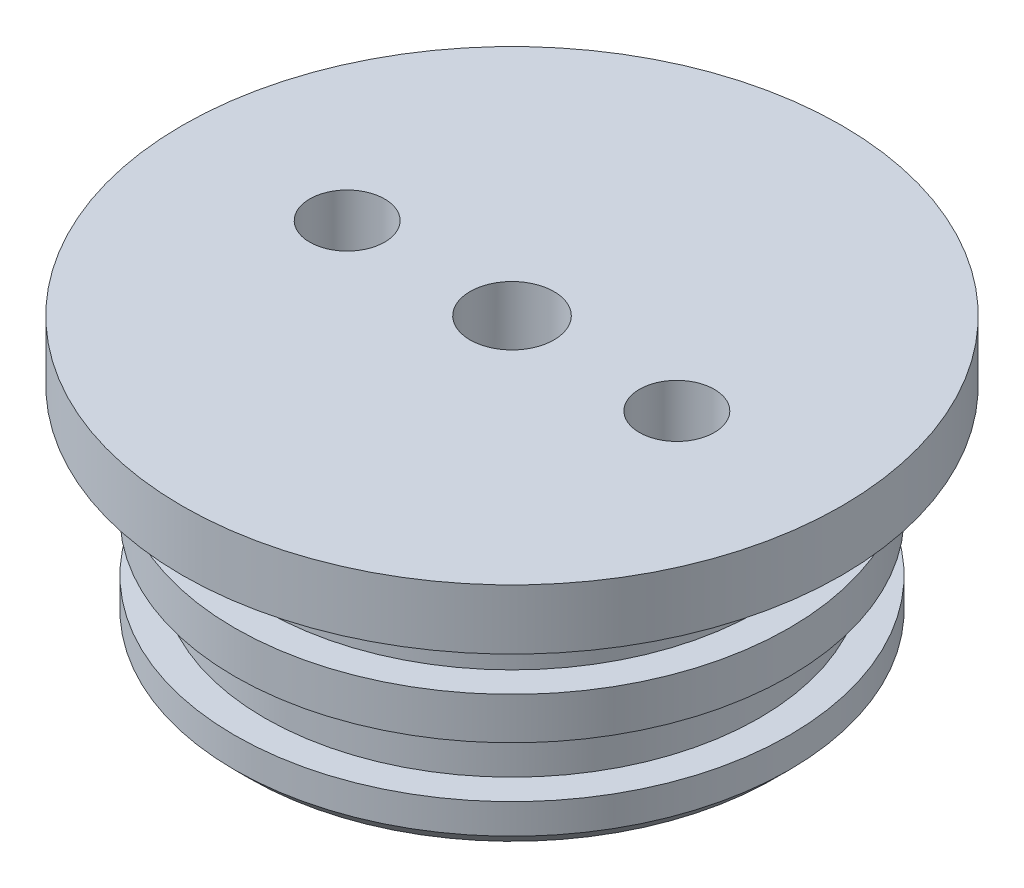
ISO-10303-21;
HEADER;
FILE_DESCRIPTION(('STEP AP214'),'2;1');
FILE_NAME('part.step','',(''),(''),'','','');
FILE_SCHEMA(('AUTOMOTIVE_DESIGN { 1 0 10303 214 1 1 1 1 }'));
ENDSEC;
DATA;
#1=APPLICATION_CONTEXT('core data for automotive mechanical design processes');
#2=APPLICATION_PROTOCOL_DEFINITION('international standard','automotive_design',2000,#1);
#3=PRODUCT_CONTEXT('',#1,'mechanical');
#4=PRODUCT('Part','Part','',(#3));
#5=PRODUCT_RELATED_PRODUCT_CATEGORY('part','',(#4));
#6=PRODUCT_DEFINITION_FORMATION('','',#4);
#7=PRODUCT_DEFINITION_CONTEXT('part definition',#1,'design');
#8=PRODUCT_DEFINITION('design','',#6,#7);
#9=PRODUCT_DEFINITION_SHAPE('','',#8);
#10=(LENGTH_UNIT() NAMED_UNIT(*) SI_UNIT(.MILLI.,.METRE.));
#11=(NAMED_UNIT(*) PLANE_ANGLE_UNIT() SI_UNIT($,.RADIAN.));
#12=(NAMED_UNIT(*) SI_UNIT($,.STERADIAN.) SOLID_ANGLE_UNIT());
#13=UNCERTAINTY_MEASURE_WITH_UNIT(LENGTH_MEASURE(1.E-05),#10,'distance_accuracy_value','');
#14=(GEOMETRIC_REPRESENTATION_CONTEXT(3) GLOBAL_UNCERTAINTY_ASSIGNED_CONTEXT((#13)) GLOBAL_UNIT_ASSIGNED_CONTEXT((#10,
#11,#12)) REPRESENTATION_CONTEXT('',''));
#15=CARTESIAN_POINT('',(0.,0.,0.));
#16=DIRECTION('',(0.,0.,1.));
#17=DIRECTION('',(1.,0.,0.));
#18=AXIS2_PLACEMENT_3D('',#15,#16,#17);
#19=CARTESIAN_POINT('',(2.5,7.,3.));
#20=DIRECTION('',(1.,0.,0.));
#21=DIRECTION('',(0.,0.,-1.));
#22=AXIS2_PLACEMENT_3D('',#19,#20,#21);
#23=PLANE('',#22);
#24=DIRECTION('',(0.,0.,-1.));
#25=VECTOR('',#24,1.);
#26=CARTESIAN_POINT('',(2.5,2.,0.));
#27=LINE('',#26,#25);
#28=CARTESIAN_POINT('',(2.5,2.,3.));
#29=VERTEX_POINT('',#28);
#30=CARTESIAN_POINT('',(2.5,2.,-3.));
#31=VERTEX_POINT('',#30);
#32=EDGE_CURVE('E101',#29,#31,#27,.T.);
#33=ORIENTED_EDGE('',*,*,#32,.F.);
#34=DIRECTION('',(0.,-1.,0.));
#35=VECTOR('',#34,1.);
#36=CARTESIAN_POINT('',(2.5,7.,3.));
#37=LINE('',#36,#35);
#38=CARTESIAN_POINT('',(2.5,7.,3.));
#39=VERTEX_POINT('',#38);
#40=EDGE_CURVE('E110',#39,#29,#37,.T.);
#41=ORIENTED_EDGE('',*,*,#40,.F.);
#42=DIRECTION('',(0.,0.,1.));
#43=VECTOR('',#42,1.);
#44=CARTESIAN_POINT('',(2.5,7.,3.));
#45=LINE('',#44,#43);
#46=CARTESIAN_POINT('',(2.5,7.,-3.));
#47=VERTEX_POINT('',#46);
#48=EDGE_CURVE('E165',#47,#39,#45,.T.);
#49=ORIENTED_EDGE('',*,*,#48,.F.);
#50=DIRECTION('',(0.,-1.,0.));
#51=VECTOR('',#50,1.);
#52=CARTESIAN_POINT('',(2.5,7.,-3.));
#53=LINE('',#52,#51);
#54=EDGE_CURVE('E112',#47,#31,#53,.T.);
#55=ORIENTED_EDGE('',*,*,#54,.T.);
#56=EDGE_LOOP('',(#33,#41,#49,#55));
#57=FACE_BOUND('',#56,.T.);
#58=ADVANCED_FACE('F35',(#57),#23,.F.);
#59=CARTESIAN_POINT('',(-2.5,7.,-3.));
#60=DIRECTION('',(0.,0.,-1.));
#61=DIRECTION('',(-1.,0.,0.));
#62=AXIS2_PLACEMENT_3D('',#59,#60,#61);
#63=PLANE('',#62);
#64=DIRECTION('',(-1.,0.,0.));
#65=VECTOR('',#64,1.);
#66=CARTESIAN_POINT('',(0.,2.,-3.));
#67=LINE('',#66,#65);
#68=CARTESIAN_POINT('',(-2.5,2.,-3.));
#69=VERTEX_POINT('',#68);
#70=EDGE_CURVE('E113',#31,#69,#67,.T.);
#71=ORIENTED_EDGE('',*,*,#70,.F.);
#72=ORIENTED_EDGE('',*,*,#54,.F.);
#73=DIRECTION('',(1.,0.,0.));
#74=VECTOR('',#73,1.);
#75=CARTESIAN_POINT('',(-2.5,7.,-3.));
#76=LINE('',#75,#74);
#77=CARTESIAN_POINT('',(-2.5,7.,-3.));
#78=VERTEX_POINT('',#77);
#79=EDGE_CURVE('E120',#78,#47,#76,.T.);
#80=ORIENTED_EDGE('',*,*,#79,.F.);
#81=DIRECTION('',(0.,-1.,0.));
#82=VECTOR('',#81,1.);
#83=CARTESIAN_POINT('',(-2.5,7.,-3.));
#84=LINE('',#83,#82);
#85=EDGE_CURVE('E122',#78,#69,#84,.T.);
#86=ORIENTED_EDGE('',*,*,#85,.T.);
#87=EDGE_LOOP('',(#71,#72,#80,#86));
#88=FACE_BOUND('',#87,.T.);
#89=ADVANCED_FACE('F196',(#88),#63,.F.);
#90=CARTESIAN_POINT('',(-2.5,7.,3.));
#91=DIRECTION('',(-1.,0.,0.));
#92=DIRECTION('',(0.,0.,1.));
#93=AXIS2_PLACEMENT_3D('',#90,#91,#92);
#94=PLANE('',#93);
#95=DIRECTION('',(0.,0.,1.));
#96=VECTOR('',#95,1.);
#97=CARTESIAN_POINT('',(-2.5,2.,0.));
#98=LINE('',#97,#96);
#99=CARTESIAN_POINT('',(-2.5,2.,3.));
#100=VERTEX_POINT('',#99);
#101=EDGE_CURVE('E58',#69,#100,#98,.T.);
#102=ORIENTED_EDGE('',*,*,#101,.F.);
#103=ORIENTED_EDGE('',*,*,#85,.F.);
#104=DIRECTION('',(0.,0.,-1.));
#105=VECTOR('',#104,1.);
#106=CARTESIAN_POINT('',(-2.5,7.,3.));
#107=LINE('',#106,#105);
#108=CARTESIAN_POINT('',(-2.5,7.,3.));
#109=VERTEX_POINT('',#108);
#110=EDGE_CURVE('E125',#109,#78,#107,.T.);
#111=ORIENTED_EDGE('',*,*,#110,.F.);
#112=DIRECTION('',(0.,-1.,0.));
#113=VECTOR('',#112,1.);
#114=CARTESIAN_POINT('',(-2.5,7.,3.));
#115=LINE('',#114,#113);
#116=EDGE_CURVE('E119',#109,#100,#115,.T.);
#117=ORIENTED_EDGE('',*,*,#116,.T.);
#118=EDGE_LOOP('',(#102,#103,#111,#117));
#119=FACE_BOUND('',#118,.T.);
#120=ADVANCED_FACE('F201',(#119),#94,.F.);
#121=CARTESIAN_POINT('',(-2.5,7.,3.));
#122=DIRECTION('',(0.,0.,1.));
#123=DIRECTION('',(1.,0.,0.));
#124=AXIS2_PLACEMENT_3D('',#121,#122,#123);
#125=PLANE('',#124);
#126=DIRECTION('',(1.,0.,0.));
#127=VECTOR('',#126,1.);
#128=CARTESIAN_POINT('',(0.,2.,3.));
#129=LINE('',#128,#127);
#130=EDGE_CURVE('E97',#100,#29,#129,.T.);
#131=ORIENTED_EDGE('',*,*,#130,.F.);
#132=ORIENTED_EDGE('',*,*,#116,.F.);
#133=DIRECTION('',(-1.,0.,0.));
#134=VECTOR('',#133,1.);
#135=CARTESIAN_POINT('',(-2.5,7.,3.));
#136=LINE('',#135,#134);
#137=EDGE_CURVE('E117',#39,#109,#136,.T.);
#138=ORIENTED_EDGE('',*,*,#137,.F.);
#139=ORIENTED_EDGE('',*,*,#40,.T.);
#140=EDGE_LOOP('',(#131,#132,#138,#139));
#141=FACE_BOUND('',#140,.T.);
#142=ADVANCED_FACE('F115',(#141),#125,.F.);
#143=CARTESIAN_POINT('',(5.5,0.,0.));
#144=DIRECTION('',(0.,1.,0.));
#145=DIRECTION('',(0.,0.,1.));
#146=AXIS2_PLACEMENT_3D('',#143,#144,#145);
#147=CYLINDRICAL_SURFACE('',#146,0.500000000000001);
#148=CARTESIAN_POINT('',(5.5,6.5,0.));
#149=DIRECTION('',(0.,1.,0.));
#150=DIRECTION('',(0.,0.,1.));
#151=AXIS2_PLACEMENT_3D('',#148,#149,#150);
#152=CIRCLE('',#151,0.500000000000001);
#153=CARTESIAN_POINT('',(5.5,6.5,0.500000000000001));
#154=VERTEX_POINT('',#153);
#155=EDGE_CURVE('E170',#154,#154,#152,.F.);
#156=ORIENTED_EDGE('',*,*,#155,.F.);
#157=EDGE_LOOP('',(#156));
#158=FACE_BOUND('',#157,.T.);
#159=CARTESIAN_POINT('',(5.5,1.5,0.));
#160=DIRECTION('',(0.,-1.,0.));
#161=DIRECTION('',(0.,0.,-1.));
#162=AXIS2_PLACEMENT_3D('',#159,#160,#161);
#163=CIRCLE('',#162,0.500000000000001);
#164=CARTESIAN_POINT('',(5.5,1.5,-0.500000000000001));
#165=VERTEX_POINT('',#164);
#166=EDGE_CURVE('E177',#165,#165,#163,.F.);
#167=ORIENTED_EDGE('',*,*,#166,.F.);
#168=EDGE_LOOP('',(#167));
#169=FACE_BOUND('',#168,.T.);
#170=ADVANCED_FACE('F246',(#158,#169),#147,.F.);
#171=CARTESIAN_POINT('',(-5.5,0.,0.));
#172=DIRECTION('',(0.,1.,0.));
#173=DIRECTION('',(0.,0.,1.));
#174=AXIS2_PLACEMENT_3D('',#171,#172,#173);
#175=CYLINDRICAL_SURFACE('',#174,0.500000000000001);
#176=CARTESIAN_POINT('',(-5.5,6.5,0.));
#177=DIRECTION('',(0.,1.,0.));
#178=DIRECTION('',(0.,0.,1.));
#179=AXIS2_PLACEMENT_3D('',#176,#177,#178);
#180=CIRCLE('',#179,0.500000000000001);
#181=CARTESIAN_POINT('',(-5.5,6.5,0.500000000000001));
#182=VERTEX_POINT('',#181);
#183=EDGE_CURVE('E167',#182,#182,#180,.F.);
#184=ORIENTED_EDGE('',*,*,#183,.F.);
#185=EDGE_LOOP('',(#184));
#186=FACE_BOUND('',#185,.T.);
#187=CARTESIAN_POINT('',(-5.5,1.5,0.));
#188=DIRECTION('',(0.,-1.,0.));
#189=DIRECTION('',(0.,0.,-1.));
#190=AXIS2_PLACEMENT_3D('',#187,#188,#189);
#191=CIRCLE('',#190,0.500000000000001);
#192=CARTESIAN_POINT('',(-5.5,1.5,-0.500000000000001));
#193=VERTEX_POINT('',#192);
#194=EDGE_CURVE('E174',#193,#193,#191,.F.);
#195=ORIENTED_EDGE('',*,*,#194,.F.);
#196=EDGE_LOOP('',(#195));
#197=FACE_BOUND('',#196,.T.);
#198=ADVANCED_FACE('F238',(#186,#197),#175,.F.);
#199=CARTESIAN_POINT('',(0.,7.,0.));
#200=DIRECTION('',(0.,-1.,0.));
#201=DIRECTION('',(0.,0.,-1.));
#202=AXIS2_PLACEMENT_3D('',#199,#200,#201);
#203=CYLINDRICAL_SURFACE('',#202,9.25);
#204=CARTESIAN_POINT('',(0.,7.,0.));
#205=DIRECTION('',(0.,-1.,0.));
#206=DIRECTION('',(0.,0.,-1.));
#207=AXIS2_PLACEMENT_3D('',#204,#205,#206);
#208=CIRCLE('',#207,9.25);
#209=CARTESIAN_POINT('',(0.,7.,-9.25));
#210=VERTEX_POINT('',#209);
#211=EDGE_CURVE('E142',#210,#210,#208,.T.);
#212=ORIENTED_EDGE('',*,*,#211,.T.);
#213=EDGE_LOOP('',(#212));
#214=FACE_BOUND('',#213,.T.);
#215=CARTESIAN_POINT('',(0.,6.3,0.));
#216=DIRECTION('',(0.,-1.,0.));
#217=DIRECTION('',(0.,0.,-1.));
#218=AXIS2_PLACEMENT_3D('',#215,#216,#217);
#219=CIRCLE('',#218,9.25);
#220=CARTESIAN_POINT('',(0.,6.3,-9.25));
#221=VERTEX_POINT('',#220);
#222=EDGE_CURVE('E146',#221,#221,#219,.F.);
#223=ORIENTED_EDGE('',*,*,#222,.T.);
#224=EDGE_LOOP('',(#223));
#225=FACE_BOUND('',#224,.T.);
#226=ADVANCED_FACE('F234',(#214,#225),#203,.T.);
#227=CARTESIAN_POINT('',(0.,0.500000000000007,0.));
#228=DIRECTION('',(0.,1.,0.));
#229=DIRECTION('',(0.,0.,1.));
#230=AXIS2_PLACEMENT_3D('',#227,#228,#229);
#231=CIRCLE('',#230,9.25);
#232=CARTESIAN_POINT('',(0.,0.500000000000007,9.25));
#233=VERTEX_POINT('',#232);
#234=EDGE_CURVE('E11',#233,#233,#231,.T.);
#235=ORIENTED_EDGE('',*,*,#234,.T.);
#236=EDGE_LOOP('',(#235));
#237=FACE_BOUND('',#236,.T.);
#238=CARTESIAN_POINT('',(0.,1.5,0.));
#239=DIRECTION('',(0.,1.,0.));
#240=DIRECTION('',(0.,0.,1.));
#241=AXIS2_PLACEMENT_3D('',#238,#239,#240);
#242=CIRCLE('',#241,9.25);
#243=CARTESIAN_POINT('',(0.,1.5,9.25));
#244=VERTEX_POINT('',#243);
#245=EDGE_CURVE('E136',#244,#244,#242,.F.);
#246=ORIENTED_EDGE('',*,*,#245,.T.);
#247=EDGE_LOOP('',(#246));
#248=FACE_BOUND('',#247,.T.);
#249=ADVANCED_FACE('F237',(#237,#248),#203,.T.);
#250=CARTESIAN_POINT('',(0.,9.,0.));
#251=DIRECTION('',(0.,-1.,0.));
#252=DIRECTION('',(0.,0.,-1.));
#253=AXIS2_PLACEMENT_3D('',#250,#251,#252);
#254=CYLINDRICAL_SURFACE('',#253,11.);
#255=CARTESIAN_POINT('',(0.,9.,0.));
#256=DIRECTION('',(0.,1.,0.));
#257=DIRECTION('',(0.,0.,1.));
#258=AXIS2_PLACEMENT_3D('',#255,#256,#257);
#259=CIRCLE('',#258,11.);
#260=CARTESIAN_POINT('',(0.,9.,11.));
#261=VERTEX_POINT('',#260);
#262=EDGE_CURVE('E147',#261,#261,#259,.T.);
#263=ORIENTED_EDGE('',*,*,#262,.F.);
#264=EDGE_LOOP('',(#263));
#265=FACE_BOUND('',#264,.T.);
#266=CARTESIAN_POINT('',(0.,7.,0.));
#267=DIRECTION('',(0.,-1.,0.));
#268=DIRECTION('',(0.,0.,-1.));
#269=AXIS2_PLACEMENT_3D('',#266,#267,#268);
#270=CIRCLE('',#269,11.);
#271=CARTESIAN_POINT('',(0.,7.,-11.));
#272=VERTEX_POINT('',#271);
#273=EDGE_CURVE('E145',#272,#272,#270,.T.);
#274=ORIENTED_EDGE('',*,*,#273,.F.);
#275=EDGE_LOOP('',(#274));
#276=FACE_BOUND('',#275,.T.);
#277=ADVANCED_FACE('F255',(#265,#276),#254,.T.);
#278=CARTESIAN_POINT('',(0.,0.,0.));
#279=DIRECTION('',(0.,1.,0.));
#280=DIRECTION('',(0.,0.,1.));
#281=AXIS2_PLACEMENT_3D('',#278,#279,#280);
#282=PLANE('',#281);
#283=CARTESIAN_POINT('',(0.,0.,0.));
#284=DIRECTION('',(0.,1.,0.));
#285=DIRECTION('',(0.,0.,1.));
#286=AXIS2_PLACEMENT_3D('',#283,#284,#285);
#287=CIRCLE('',#286,8.75);
#288=CARTESIAN_POINT('',(0.,0.,8.75));
#289=VERTEX_POINT('',#288);
#290=EDGE_CURVE('E43',#289,#289,#287,.F.);
#291=ORIENTED_EDGE('',*,*,#290,.T.);
#292=EDGE_LOOP('',(#291));
#293=FACE_BOUND('',#292,.T.);
#294=DIRECTION('',(0.,0.,1.));
#295=VECTOR('',#294,1.);
#296=CARTESIAN_POINT('',(3.5,0.,0.));
#297=LINE('',#296,#295);
#298=CARTESIAN_POINT('',(3.5,0.,-4.));
#299=VERTEX_POINT('',#298);
#300=CARTESIAN_POINT('',(3.5,0.,4.));
#301=VERTEX_POINT('',#300);
#302=EDGE_CURVE('E582',#299,#301,#297,.T.);
#303=ORIENTED_EDGE('',*,*,#302,.F.);
#304=DIRECTION('',(1.,0.,0.));
#305=VECTOR('',#304,1.);
#306=CARTESIAN_POINT('',(0.,0.,-4.));
#307=LINE('',#306,#305);
#308=CARTESIAN_POINT('',(-3.5,0.,-4.));
#309=VERTEX_POINT('',#308);
#310=EDGE_CURVE('E50',#309,#299,#307,.T.);
#311=ORIENTED_EDGE('',*,*,#310,.F.);
#312=DIRECTION('',(0.,0.,-1.));
#313=VECTOR('',#312,1.);
#314=CARTESIAN_POINT('',(-3.5,0.,0.));
#315=LINE('',#314,#313);
#316=CARTESIAN_POINT('',(-3.5,0.,4.));
#317=VERTEX_POINT('',#316);
#318=EDGE_CURVE('E537',#317,#309,#315,.T.);
#319=ORIENTED_EDGE('',*,*,#318,.F.);
#320=DIRECTION('',(-1.,0.,0.));
#321=VECTOR('',#320,1.);
#322=CARTESIAN_POINT('',(0.,0.,4.));
#323=LINE('',#322,#321);
#324=EDGE_CURVE('E579',#301,#317,#323,.T.);
#325=ORIENTED_EDGE('',*,*,#324,.F.);
#326=EDGE_LOOP('',(#303,#311,#319,#325));
#327=FACE_BOUND('',#326,.T.);
#328=CARTESIAN_POINT('',(-5.5,0.,0.));
#329=DIRECTION('',(0.,-1.,0.));
#330=DIRECTION('',(0.,0.,-1.));
#331=AXIS2_PLACEMENT_3D('',#328,#329,#330);
#332=CIRCLE('',#331,1.25);
#333=CARTESIAN_POINT('',(-5.5,0.,-1.25));
#334=VERTEX_POINT('',#333);
#335=EDGE_CURVE('E564',#334,#334,#332,.T.);
#336=ORIENTED_EDGE('',*,*,#335,.F.);
#337=EDGE_LOOP('',(#336));
#338=FACE_BOUND('',#337,.T.);
#339=CARTESIAN_POINT('',(5.5,0.,0.));
#340=DIRECTION('',(0.,-1.,0.));
#341=DIRECTION('',(0.,0.,-1.));
#342=AXIS2_PLACEMENT_3D('',#339,#340,#341);
#343=CIRCLE('',#342,1.25);
#344=CARTESIAN_POINT('',(5.5,0.,-1.25));
#345=VERTEX_POINT('',#344);
#346=EDGE_CURVE('E557',#345,#345,#343,.T.);
#347=ORIENTED_EDGE('',*,*,#346,.F.);
#348=EDGE_LOOP('',(#347));
#349=FACE_BOUND('',#348,.T.);
#350=ADVANCED_FACE('F184',(#293,#327,#338,#349),#282,.F.);
#351=CARTESIAN_POINT('',(0.,9.,0.));
#352=DIRECTION('',(0.,1.,0.));
#353=DIRECTION('',(0.,0.,1.));
#354=AXIS2_PLACEMENT_3D('',#351,#352,#353);
#355=PLANE('',#354);
#356=CARTESIAN_POINT('',(-5.5,9.,0.));
#357=DIRECTION('',(0.,1.,0.));
#358=DIRECTION('',(0.,0.,1.));
#359=AXIS2_PLACEMENT_3D('',#356,#357,#358);
#360=CIRCLE('',#359,1.25);
#361=CARTESIAN_POINT('',(-5.5,9.,1.25));
#362=VERTEX_POINT('',#361);
#363=EDGE_CURVE('E552',#362,#362,#360,.T.);
#364=ORIENTED_EDGE('',*,*,#363,.F.);
#365=EDGE_LOOP('',(#364));
#366=FACE_BOUND('',#365,.T.);
#367=CARTESIAN_POINT('',(5.5,9.,0.));
#368=DIRECTION('',(0.,1.,0.));
#369=DIRECTION('',(0.,0.,1.));
#370=AXIS2_PLACEMENT_3D('',#367,#368,#369);
#371=CIRCLE('',#370,1.25);
#372=CARTESIAN_POINT('',(5.5,9.,1.25));
#373=VERTEX_POINT('',#372);
#374=EDGE_CURVE('E180',#373,#373,#371,.T.);
#375=ORIENTED_EDGE('',*,*,#374,.F.);
#376=EDGE_LOOP('',(#375));
#377=FACE_BOUND('',#376,.T.);
#378=CARTESIAN_POINT('',(0.,9.,0.));
#379=DIRECTION('',(0.,1.,0.));
#380=DIRECTION('',(0.,0.,1.));
#381=AXIS2_PLACEMENT_3D('',#378,#379,#380);
#382=CIRCLE('',#381,1.4);
#383=CARTESIAN_POINT('',(0.,9.,1.4));
#384=VERTEX_POINT('',#383);
#385=EDGE_CURVE('E166',#384,#384,#382,.T.);
#386=ORIENTED_EDGE('',*,*,#385,.F.);
#387=EDGE_LOOP('',(#386));
#388=FACE_BOUND('',#387,.T.);
#389=ORIENTED_EDGE('',*,*,#262,.T.);
#390=EDGE_LOOP('',(#389));
#391=FACE_BOUND('',#390,.T.);
#392=ADVANCED_FACE('F242',(#366,#377,#388,#391),#355,.T.);
#393=CARTESIAN_POINT('',(0.,7.,0.));
#394=DIRECTION('',(0.,-1.,0.));
#395=DIRECTION('',(0.,0.,-1.));
#396=AXIS2_PLACEMENT_3D('',#393,#394,#395);
#397=PLANE('',#396);
#398=ORIENTED_EDGE('',*,*,#211,.F.);
#399=EDGE_LOOP('',(#398));
#400=FACE_BOUND('',#399,.T.);
#401=ORIENTED_EDGE('',*,*,#273,.T.);
#402=EDGE_LOOP('',(#401));
#403=FACE_BOUND('',#402,.T.);
#404=ADVANCED_FACE('F232',(#400,#403),#397,.T.);
#405=CARTESIAN_POINT('',(0.,0.,0.));
#406=DIRECTION('',(0.,-1.,0.));
#407=DIRECTION('',(0.,0.,-1.));
#408=AXIS2_PLACEMENT_3D('',#405,#406,#407);
#409=CYLINDRICAL_SURFACE('',#408,8.25);
#410=CARTESIAN_POINT('',(0.,3.2,0.));
#411=DIRECTION('',(0.,-1.,0.));
#412=DIRECTION('',(0.,0.,-1.));
#413=AXIS2_PLACEMENT_3D('',#410,#411,#412);
#414=CIRCLE('',#413,8.25);
#415=CARTESIAN_POINT('',(0.,3.2,-8.25));
#416=VERTEX_POINT('',#415);
#417=EDGE_CURVE('E133',#416,#416,#414,.T.);
#418=ORIENTED_EDGE('',*,*,#417,.T.);
#419=EDGE_LOOP('',(#418));
#420=FACE_BOUND('',#419,.T.);
#421=CARTESIAN_POINT('',(0.,1.5,0.));
#422=DIRECTION('',(0.,-1.,0.));
#423=DIRECTION('',(0.,0.,-1.));
#424=AXIS2_PLACEMENT_3D('',#421,#422,#423);
#425=CIRCLE('',#424,8.25);
#426=CARTESIAN_POINT('',(0.,1.5,-8.25));
#427=VERTEX_POINT('',#426);
#428=EDGE_CURVE('E137',#427,#427,#425,.T.);
#429=ORIENTED_EDGE('',*,*,#428,.F.);
#430=EDGE_LOOP('',(#429));
#431=FACE_BOUND('',#430,.T.);
#432=ADVANCED_FACE('F228',(#420,#431),#409,.T.);
#433=CARTESIAN_POINT('',(-10.25,3.2,0.));
#434=DIRECTION('',(0.,-1.,0.));
#435=DIRECTION('',(0.,0.,-1.));
#436=AXIS2_PLACEMENT_3D('',#433,#434,#435);
#437=PLANE('',#436);
#438=CARTESIAN_POINT('',(0.,3.2,0.));
#439=DIRECTION('',(0.,-1.,0.));
#440=DIRECTION('',(0.,0.,-1.));
#441=AXIS2_PLACEMENT_3D('',#438,#439,#440);
#442=CIRCLE('',#441,9.25);
#443=CARTESIAN_POINT('',(0.,3.2,-9.25));
#444=VERTEX_POINT('',#443);
#445=EDGE_CURVE('E154',#444,#444,#442,.F.);
#446=ORIENTED_EDGE('',*,*,#445,.F.);
#447=EDGE_LOOP('',(#446));
#448=FACE_BOUND('',#447,.T.);
#449=ORIENTED_EDGE('',*,*,#417,.F.);
#450=EDGE_LOOP('',(#449));
#451=FACE_BOUND('',#450,.T.);
#452=ADVANCED_FACE('F224',(#448,#451),#437,.T.);
#453=CARTESIAN_POINT('',(-10.25,1.5,0.));
#454=DIRECTION('',(0.,1.,0.));
#455=DIRECTION('',(0.,0.,1.));
#456=AXIS2_PLACEMENT_3D('',#453,#454,#455);
#457=PLANE('',#456);
#458=ORIENTED_EDGE('',*,*,#245,.F.);
#459=EDGE_LOOP('',(#458));
#460=FACE_BOUND('',#459,.T.);
#461=ORIENTED_EDGE('',*,*,#428,.T.);
#462=EDGE_LOOP('',(#461));
#463=FACE_BOUND('',#462,.T.);
#464=ADVANCED_FACE('F221',(#460,#463),#457,.T.);
#465=ORIENTED_EDGE('',*,*,#445,.T.);
#466=EDGE_LOOP('',(#465));
#467=FACE_BOUND('',#466,.T.);
#468=CARTESIAN_POINT('',(0.,4.6,0.));
#469=DIRECTION('',(0.,1.,0.));
#470=DIRECTION('',(0.,0.,1.));
#471=AXIS2_PLACEMENT_3D('',#468,#469,#470);
#472=CIRCLE('',#471,9.25);
#473=CARTESIAN_POINT('',(0.,4.6,9.25));
#474=VERTEX_POINT('',#473);
#475=EDGE_CURVE('E157',#474,#474,#472,.F.);
#476=ORIENTED_EDGE('',*,*,#475,.T.);
#477=EDGE_LOOP('',(#476));
#478=FACE_BOUND('',#477,.T.);
#479=ADVANCED_FACE('F219',(#467,#478),#203,.T.);
#480=CARTESIAN_POINT('',(0.,0.,0.));
#481=DIRECTION('',(0.,-1.,0.));
#482=DIRECTION('',(0.,0.,-1.));
#483=AXIS2_PLACEMENT_3D('',#480,#481,#482);
#484=CYLINDRICAL_SURFACE('',#483,8.25);
#485=CARTESIAN_POINT('',(0.,6.3,0.));
#486=DIRECTION('',(0.,-1.,0.));
#487=DIRECTION('',(0.,0.,-1.));
#488=AXIS2_PLACEMENT_3D('',#485,#486,#487);
#489=CIRCLE('',#488,8.25);
#490=CARTESIAN_POINT('',(0.,6.3,-8.25));
#491=VERTEX_POINT('',#490);
#492=EDGE_CURVE('E132',#491,#491,#489,.T.);
#493=ORIENTED_EDGE('',*,*,#492,.T.);
#494=EDGE_LOOP('',(#493));
#495=FACE_BOUND('',#494,.T.);
#496=CARTESIAN_POINT('',(0.,4.6,0.));
#497=DIRECTION('',(0.,-1.,0.));
#498=DIRECTION('',(0.,0.,-1.));
#499=AXIS2_PLACEMENT_3D('',#496,#497,#498);
#500=CIRCLE('',#499,8.25);
#501=CARTESIAN_POINT('',(0.,4.6,-8.25));
#502=VERTEX_POINT('',#501);
#503=EDGE_CURVE('E129',#502,#502,#500,.T.);
#504=ORIENTED_EDGE('',*,*,#503,.F.);
#505=EDGE_LOOP('',(#504));
#506=FACE_BOUND('',#505,.T.);
#507=ADVANCED_FACE('F215',(#495,#506),#484,.T.);
#508=CARTESIAN_POINT('',(-10.25,6.3,0.));
#509=DIRECTION('',(0.,-1.,0.));
#510=DIRECTION('',(0.,0.,-1.));
#511=AXIS2_PLACEMENT_3D('',#508,#509,#510);
#512=PLANE('',#511);
#513=ORIENTED_EDGE('',*,*,#222,.F.);
#514=EDGE_LOOP('',(#513));
#515=FACE_BOUND('',#514,.T.);
#516=ORIENTED_EDGE('',*,*,#492,.F.);
#517=EDGE_LOOP('',(#516));
#518=FACE_BOUND('',#517,.T.);
#519=ADVANCED_FACE('F211',(#515,#518),#512,.T.);
#520=CARTESIAN_POINT('',(-10.25,4.6,0.));
#521=DIRECTION('',(0.,1.,0.));
#522=DIRECTION('',(0.,0.,1.));
#523=AXIS2_PLACEMENT_3D('',#520,#521,#522);
#524=PLANE('',#523);
#525=ORIENTED_EDGE('',*,*,#475,.F.);
#526=EDGE_LOOP('',(#525));
#527=FACE_BOUND('',#526,.T.);
#528=ORIENTED_EDGE('',*,*,#503,.T.);
#529=EDGE_LOOP('',(#528));
#530=FACE_BOUND('',#529,.T.);
#531=ADVANCED_FACE('F207',(#527,#530),#524,.T.);
#532=CARTESIAN_POINT('',(0.,7.,0.));
#533=DIRECTION('',(0.,-1.,0.));
#534=DIRECTION('',(0.,0.,-1.));
#535=AXIS2_PLACEMENT_3D('',#532,#533,#534);
#536=PLANE('',#535);
#537=CARTESIAN_POINT('',(0.,7.,0.));
#538=DIRECTION('',(0.,-1.,0.));
#539=DIRECTION('',(0.,0.,-1.));
#540=AXIS2_PLACEMENT_3D('',#537,#538,#539);
#541=CIRCLE('',#540,1.4);
#542=CARTESIAN_POINT('',(0.,7.,-1.4));
#543=VERTEX_POINT('',#542);
#544=EDGE_CURVE('E162',#543,#543,#541,.T.);
#545=ORIENTED_EDGE('',*,*,#544,.F.);
#546=EDGE_LOOP('',(#545));
#547=FACE_BOUND('',#546,.T.);
#548=ORIENTED_EDGE('',*,*,#48,.T.);
#549=ORIENTED_EDGE('',*,*,#137,.T.);
#550=ORIENTED_EDGE('',*,*,#110,.T.);
#551=ORIENTED_EDGE('',*,*,#79,.T.);
#552=EDGE_LOOP('',(#548,#549,#550,#551));
#553=FACE_BOUND('',#552,.T.);
#554=ADVANCED_FACE('F210',(#547,#553),#536,.T.);
#555=CARTESIAN_POINT('',(0.,2.,0.));
#556=DIRECTION('',(0.,1.,0.));
#557=DIRECTION('',(0.,0.,1.));
#558=AXIS2_PLACEMENT_3D('',#555,#556,#557);
#559=CYLINDRICAL_SURFACE('',#558,1.4);
#560=ORIENTED_EDGE('',*,*,#544,.T.);
#561=EDGE_LOOP('',(#560));
#562=FACE_BOUND('',#561,.T.);
#563=ORIENTED_EDGE('',*,*,#385,.T.);
#564=EDGE_LOOP('',(#563));
#565=FACE_BOUND('',#564,.T.);
#566=ADVANCED_FACE('F305',(#562,#565),#559,.F.);
#567=CARTESIAN_POINT('',(-5.5,6.5,0.));
#568=DIRECTION('',(0.,1.,0.));
#569=DIRECTION('',(0.,0.,1.));
#570=AXIS2_PLACEMENT_3D('',#567,#568,#569);
#571=PLANE('',#570);
#572=CARTESIAN_POINT('',(-5.5,6.5,0.));
#573=DIRECTION('',(0.,1.,0.));
#574=DIRECTION('',(0.,0.,1.));
#575=AXIS2_PLACEMENT_3D('',#572,#573,#574);
#576=CIRCLE('',#575,1.25);
#577=CARTESIAN_POINT('',(-5.5,6.5,1.25));
#578=VERTEX_POINT('',#577);
#579=EDGE_CURVE('E171',#578,#578,#576,.T.);
#580=ORIENTED_EDGE('',*,*,#579,.T.);
#581=EDGE_LOOP('',(#580));
#582=FACE_BOUND('',#581,.T.);
#583=ORIENTED_EDGE('',*,*,#183,.T.);
#584=EDGE_LOOP('',(#583));
#585=FACE_BOUND('',#584,.T.);
#586=ADVANCED_FACE('F313',(#582,#585),#571,.T.);
#587=CARTESIAN_POINT('',(-5.5,6.5,0.));
#588=DIRECTION('',(0.,1.,0.));
#589=DIRECTION('',(0.,0.,1.));
#590=AXIS2_PLACEMENT_3D('',#587,#588,#589);
#591=CYLINDRICAL_SURFACE('',#590,1.25);
#592=ORIENTED_EDGE('',*,*,#579,.F.);
#593=EDGE_LOOP('',(#592));
#594=FACE_BOUND('',#593,.T.);
#595=ORIENTED_EDGE('',*,*,#363,.T.);
#596=EDGE_LOOP('',(#595));
#597=FACE_BOUND('',#596,.T.);
#598=ADVANCED_FACE('F322',(#594,#597),#591,.F.);
#599=CARTESIAN_POINT('',(5.5,6.5,0.));
#600=DIRECTION('',(0.,1.,0.));
#601=DIRECTION('',(0.,0.,1.));
#602=AXIS2_PLACEMENT_3D('',#599,#600,#601);
#603=PLANE('',#602);
#604=CARTESIAN_POINT('',(5.5,6.5,0.));
#605=DIRECTION('',(0.,1.,0.));
#606=DIRECTION('',(0.,0.,1.));
#607=AXIS2_PLACEMENT_3D('',#604,#605,#606);
#608=CIRCLE('',#607,1.25);
#609=CARTESIAN_POINT('',(5.5,6.5,1.25));
#610=VERTEX_POINT('',#609);
#611=EDGE_CURVE('E549',#610,#610,#608,.T.);
#612=ORIENTED_EDGE('',*,*,#611,.T.);
#613=EDGE_LOOP('',(#612));
#614=FACE_BOUND('',#613,.T.);
#615=ORIENTED_EDGE('',*,*,#155,.T.);
#616=EDGE_LOOP('',(#615));
#617=FACE_BOUND('',#616,.T.);
#618=ADVANCED_FACE('F330',(#614,#617),#603,.T.);
#619=CARTESIAN_POINT('',(5.5,6.5,0.));
#620=DIRECTION('',(0.,1.,0.));
#621=DIRECTION('',(0.,0.,1.));
#622=AXIS2_PLACEMENT_3D('',#619,#620,#621);
#623=CYLINDRICAL_SURFACE('',#622,1.25);
#624=ORIENTED_EDGE('',*,*,#611,.F.);
#625=EDGE_LOOP('',(#624));
#626=FACE_BOUND('',#625,.T.);
#627=ORIENTED_EDGE('',*,*,#374,.T.);
#628=EDGE_LOOP('',(#627));
#629=FACE_BOUND('',#628,.T.);
#630=ADVANCED_FACE('F338',(#626,#629),#623,.F.);
#631=CARTESIAN_POINT('',(5.5,1.5,0.));
#632=DIRECTION('',(0.,-1.,0.));
#633=DIRECTION('',(0.,0.,-1.));
#634=AXIS2_PLACEMENT_3D('',#631,#632,#633);
#635=PLANE('',#634);
#636=CARTESIAN_POINT('',(5.5,1.5,0.));
#637=DIRECTION('',(0.,-1.,0.));
#638=DIRECTION('',(0.,0.,-1.));
#639=AXIS2_PLACEMENT_3D('',#636,#637,#638);
#640=CIRCLE('',#639,1.25);
#641=CARTESIAN_POINT('',(5.5,1.5,-1.25));
#642=VERTEX_POINT('',#641);
#643=EDGE_CURVE('E560',#642,#642,#640,.T.);
#644=ORIENTED_EDGE('',*,*,#643,.T.);
#645=EDGE_LOOP('',(#644));
#646=FACE_BOUND('',#645,.T.);
#647=ORIENTED_EDGE('',*,*,#166,.T.);
#648=EDGE_LOOP('',(#647));
#649=FACE_BOUND('',#648,.T.);
#650=ADVANCED_FACE('F346',(#646,#649),#635,.T.);
#651=CARTESIAN_POINT('',(5.5,1.5,0.));
#652=DIRECTION('',(0.,-1.,0.));
#653=DIRECTION('',(0.,0.,-1.));
#654=AXIS2_PLACEMENT_3D('',#651,#652,#653);
#655=CYLINDRICAL_SURFACE('',#654,1.25);
#656=ORIENTED_EDGE('',*,*,#643,.F.);
#657=EDGE_LOOP('',(#656));
#658=FACE_BOUND('',#657,.T.);
#659=ORIENTED_EDGE('',*,*,#346,.T.);
#660=EDGE_LOOP('',(#659));
#661=FACE_BOUND('',#660,.T.);
#662=ADVANCED_FACE('F355',(#658,#661),#655,.F.);
#663=CARTESIAN_POINT('',(-5.5,1.5,0.));
#664=DIRECTION('',(0.,-1.,0.));
#665=DIRECTION('',(0.,0.,-1.));
#666=AXIS2_PLACEMENT_3D('',#663,#664,#665);
#667=PLANE('',#666);
#668=CARTESIAN_POINT('',(-5.5,1.5,0.));
#669=DIRECTION('',(0.,-1.,0.));
#670=DIRECTION('',(0.,0.,-1.));
#671=AXIS2_PLACEMENT_3D('',#668,#669,#670);
#672=CIRCLE('',#671,1.25);
#673=CARTESIAN_POINT('',(-5.5,1.5,-1.25));
#674=VERTEX_POINT('',#673);
#675=EDGE_CURVE('E178',#674,#674,#672,.T.);
#676=ORIENTED_EDGE('',*,*,#675,.T.);
#677=EDGE_LOOP('',(#676));
#678=FACE_BOUND('',#677,.T.);
#679=ORIENTED_EDGE('',*,*,#194,.T.);
#680=EDGE_LOOP('',(#679));
#681=FACE_BOUND('',#680,.T.);
#682=ADVANCED_FACE('F364',(#678,#681),#667,.T.);
#683=CARTESIAN_POINT('',(-5.5,1.5,0.));
#684=DIRECTION('',(0.,-1.,0.));
#685=DIRECTION('',(0.,0.,-1.));
#686=AXIS2_PLACEMENT_3D('',#683,#684,#685);
#687=CYLINDRICAL_SURFACE('',#686,1.25);
#688=ORIENTED_EDGE('',*,*,#675,.F.);
#689=EDGE_LOOP('',(#688));
#690=FACE_BOUND('',#689,.T.);
#691=ORIENTED_EDGE('',*,*,#335,.T.);
#692=EDGE_LOOP('',(#691));
#693=FACE_BOUND('',#692,.T.);
#694=ADVANCED_FACE('F372',(#690,#693),#687,.F.);
#695=CARTESIAN_POINT('',(0.,2.,-4.));
#696=DIRECTION('',(0.,0.,-1.));
#697=DIRECTION('',(-1.,0.,0.));
#698=AXIS2_PLACEMENT_3D('',#695,#696,#697);
#699=PLANE('',#698);
#700=ORIENTED_EDGE('',*,*,#310,.T.);
#701=DIRECTION('',(0.,-1.,0.));
#702=VECTOR('',#701,1.);
#703=CARTESIAN_POINT('',(3.5,2.,-4.));
#704=LINE('',#703,#702);
#705=CARTESIAN_POINT('',(3.5,2.,-4.));
#706=VERTEX_POINT('',#705);
#707=EDGE_CURVE('E569',#706,#299,#704,.T.);
#708=ORIENTED_EDGE('',*,*,#707,.F.);
#709=DIRECTION('',(1.,0.,0.));
#710=VECTOR('',#709,1.);
#711=CARTESIAN_POINT('',(0.,2.,-4.));
#712=LINE('',#711,#710);
#713=CARTESIAN_POINT('',(-3.5,2.,-4.));
#714=VERTEX_POINT('',#713);
#715=EDGE_CURVE('E594',#714,#706,#712,.T.);
#716=ORIENTED_EDGE('',*,*,#715,.F.);
#717=DIRECTION('',(0.,-1.,0.));
#718=VECTOR('',#717,1.);
#719=CARTESIAN_POINT('',(-3.5,2.,-4.));
#720=LINE('',#719,#718);
#721=EDGE_CURVE('E561',#714,#309,#720,.T.);
#722=ORIENTED_EDGE('',*,*,#721,.T.);
#723=EDGE_LOOP('',(#700,#708,#716,#722));
#724=FACE_BOUND('',#723,.T.);
#725=ADVANCED_FACE('F380',(#724),#699,.F.);
#726=CARTESIAN_POINT('',(-3.5,2.,0.));
#727=DIRECTION('',(-1.,0.,0.));
#728=DIRECTION('',(0.,0.,1.));
#729=AXIS2_PLACEMENT_3D('',#726,#727,#728);
#730=PLANE('',#729);
#731=ORIENTED_EDGE('',*,*,#318,.T.);
#732=ORIENTED_EDGE('',*,*,#721,.F.);
#733=DIRECTION('',(0.,0.,-1.));
#734=VECTOR('',#733,1.);
#735=CARTESIAN_POINT('',(-3.5,2.,0.));
#736=LINE('',#735,#734);
#737=CARTESIAN_POINT('',(-3.5,2.,4.));
#738=VERTEX_POINT('',#737);
#739=EDGE_CURVE('E572',#738,#714,#736,.T.);
#740=ORIENTED_EDGE('',*,*,#739,.F.);
#741=DIRECTION('',(0.,-1.,0.));
#742=VECTOR('',#741,1.);
#743=CARTESIAN_POINT('',(-3.5,2.,4.));
#744=LINE('',#743,#742);
#745=EDGE_CURVE('E574',#738,#317,#744,.T.);
#746=ORIENTED_EDGE('',*,*,#745,.T.);
#747=EDGE_LOOP('',(#731,#732,#740,#746));
#748=FACE_BOUND('',#747,.T.);
#749=ADVANCED_FACE('F388',(#748),#730,.F.);
#750=CARTESIAN_POINT('',(0.,2.,4.));
#751=DIRECTION('',(0.,0.,1.));
#752=DIRECTION('',(1.,0.,0.));
#753=AXIS2_PLACEMENT_3D('',#750,#751,#752);
#754=PLANE('',#753);
#755=ORIENTED_EDGE('',*,*,#324,.T.);
#756=ORIENTED_EDGE('',*,*,#745,.F.);
#757=DIRECTION('',(-1.,0.,0.));
#758=VECTOR('',#757,1.);
#759=CARTESIAN_POINT('',(0.,2.,4.));
#760=LINE('',#759,#758);
#761=CARTESIAN_POINT('',(3.5,2.,4.));
#762=VERTEX_POINT('',#761);
#763=EDGE_CURVE('E588',#762,#738,#760,.T.);
#764=ORIENTED_EDGE('',*,*,#763,.F.);
#765=DIRECTION('',(0.,-1.,0.));
#766=VECTOR('',#765,1.);
#767=CARTESIAN_POINT('',(3.5,2.,4.));
#768=LINE('',#767,#766);
#769=EDGE_CURVE('E571',#762,#301,#768,.T.);
#770=ORIENTED_EDGE('',*,*,#769,.T.);
#771=EDGE_LOOP('',(#755,#756,#764,#770));
#772=FACE_BOUND('',#771,.T.);
#773=ADVANCED_FACE('F396',(#772),#754,.F.);
#774=CARTESIAN_POINT('',(3.5,2.,0.));
#775=DIRECTION('',(1.,0.,0.));
#776=DIRECTION('',(0.,0.,-1.));
#777=AXIS2_PLACEMENT_3D('',#774,#775,#776);
#778=PLANE('',#777);
#779=ORIENTED_EDGE('',*,*,#302,.T.);
#780=ORIENTED_EDGE('',*,*,#769,.F.);
#781=DIRECTION('',(0.,0.,1.));
#782=VECTOR('',#781,1.);
#783=CARTESIAN_POINT('',(3.5,2.,0.));
#784=LINE('',#783,#782);
#785=EDGE_CURVE('E591',#706,#762,#784,.T.);
#786=ORIENTED_EDGE('',*,*,#785,.F.);
#787=ORIENTED_EDGE('',*,*,#707,.T.);
#788=EDGE_LOOP('',(#779,#780,#786,#787));
#789=FACE_BOUND('',#788,.T.);
#790=ADVANCED_FACE('F192',(#789),#778,.F.);
#791=CARTESIAN_POINT('',(0.,2.,0.));
#792=DIRECTION('',(0.,-1.,0.));
#793=DIRECTION('',(0.,0.,-1.));
#794=AXIS2_PLACEMENT_3D('',#791,#792,#793);
#795=PLANE('',#794);
#796=ORIENTED_EDGE('',*,*,#101,.T.);
#797=ORIENTED_EDGE('',*,*,#130,.T.);
#798=ORIENTED_EDGE('',*,*,#32,.T.);
#799=ORIENTED_EDGE('',*,*,#70,.T.);
#800=EDGE_LOOP('',(#796,#797,#798,#799));
#801=FACE_BOUND('',#800,.T.);
#802=ORIENTED_EDGE('',*,*,#715,.T.);
#803=ORIENTED_EDGE('',*,*,#785,.T.);
#804=ORIENTED_EDGE('',*,*,#763,.T.);
#805=ORIENTED_EDGE('',*,*,#739,.T.);
#806=EDGE_LOOP('',(#802,#803,#804,#805));
#807=FACE_BOUND('',#806,.T.);
#808=ADVANCED_FACE('F99',(#801,#807),#795,.T.);
#809=CARTESIAN_POINT('',(0.,0.,0.));
#810=DIRECTION('',(0.,1.,0.));
#811=DIRECTION('',(0.,0.,1.));
#812=AXIS2_PLACEMENT_3D('',#809,#810,#811);
#813=CONICAL_SURFACE('',#812,8.75,0.785398163397443);
#814=ORIENTED_EDGE('',*,*,#234,.F.);
#815=EDGE_LOOP('',(#814));
#816=FACE_BOUND('',#815,.T.);
#817=ORIENTED_EDGE('',*,*,#290,.F.);
#818=EDGE_LOOP('',(#817));
#819=FACE_BOUND('',#818,.T.);
#820=ADVANCED_FACE('F37',(#816,#819),#813,.T.);
#821=CLOSED_SHELL('',(#58,#89,#120,#142,#170,#198,#226,#249,#277,#350,#392,#404,#432,#452,#464,
#479,#507,#519,#531,#554,#566,#586,#598,#618,#630,#650,#662,#682,#694,#725,#749,#773,#790,#808,#820));
#822=MANIFOLD_SOLID_BREP('B2',#821);
#823=ADVANCED_BREP_SHAPE_REPRESENTATION('',(#18,#822),#14);
#824=SHAPE_DEFINITION_REPRESENTATION(#9,#823);
ENDSEC;
END-ISO-10303-21;
